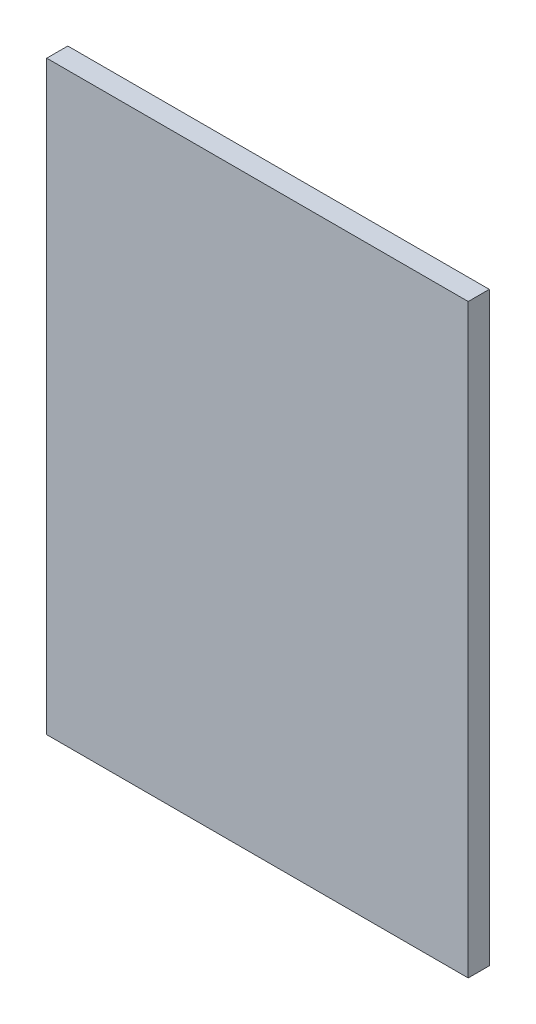
ISO-10303-21;
HEADER;
FILE_DESCRIPTION(('STEP AP214'),'2;1');
FILE_NAME('part.step','',(''),(''),'','','');
FILE_SCHEMA(('AUTOMOTIVE_DESIGN { 1 0 10303 214 1 1 1 1 }'));
ENDSEC;
DATA;
#1=APPLICATION_CONTEXT('core data for automotive mechanical design processes');
#2=APPLICATION_PROTOCOL_DEFINITION('international standard','automotive_design',2000,#1);
#3=PRODUCT_CONTEXT('',#1,'mechanical');
#4=PRODUCT('Part','Part','',(#3));
#5=PRODUCT_RELATED_PRODUCT_CATEGORY('part','',(#4));
#6=PRODUCT_DEFINITION_FORMATION('','',#4);
#7=PRODUCT_DEFINITION_CONTEXT('part definition',#1,'design');
#8=PRODUCT_DEFINITION('design','',#6,#7);
#9=PRODUCT_DEFINITION_SHAPE('','',#8);
#10=(LENGTH_UNIT() NAMED_UNIT(*) SI_UNIT(.MILLI.,.METRE.));
#11=(NAMED_UNIT(*) PLANE_ANGLE_UNIT() SI_UNIT($,.RADIAN.));
#12=(NAMED_UNIT(*) SI_UNIT($,.STERADIAN.) SOLID_ANGLE_UNIT());
#13=UNCERTAINTY_MEASURE_WITH_UNIT(LENGTH_MEASURE(1.E-05),#10,'distance_accuracy_value','');
#14=(GEOMETRIC_REPRESENTATION_CONTEXT(3) GLOBAL_UNCERTAINTY_ASSIGNED_CONTEXT((#13)) GLOBAL_UNIT_ASSIGNED_CONTEXT((#10,
#11,#12)) REPRESENTATION_CONTEXT('',''));
#15=CARTESIAN_POINT('',(0.,0.,0.));
#16=DIRECTION('',(0.,0.,1.));
#17=DIRECTION('',(1.,0.,0.));
#18=AXIS2_PLACEMENT_3D('',#15,#16,#17);
#19=CARTESIAN_POINT('',(0.,0.,0.));
#20=DIRECTION('',(0.,0.,1.));
#21=DIRECTION('',(1.,0.,0.));
#22=AXIS2_PLACEMENT_3D('',#19,#20,#21);
#23=PLANE('',#22);
#24=DIRECTION('',(1.,0.,0.));
#25=VECTOR('',#24,1.);
#26=CARTESIAN_POINT('',(-6.50000000000005,24.5,0.));
#27=LINE('',#26,#25);
#28=CARTESIAN_POINT('',(-9.00000000000004,24.5,0.));
#29=VERTEX_POINT('',#28);
#30=CARTESIAN_POINT('',(-6.50000000000005,24.5,0.));
#31=VERTEX_POINT('',#30);
#32=EDGE_CURVE('E273',#29,#31,#27,.T.);
#33=ORIENTED_EDGE('',*,*,#32,.F.);
#34=DIRECTION('',(0.,1.,0.));
#35=VECTOR('',#34,1.);
#36=CARTESIAN_POINT('',(-9.00000000000004,24.5,0.));
#37=LINE('',#36,#35);
#38=CARTESIAN_POINT('',(-9.00000000000004,-24.5,0.));
#39=VERTEX_POINT('',#38);
#40=EDGE_CURVE('E245',#39,#29,#37,.T.);
#41=ORIENTED_EDGE('',*,*,#40,.F.);
#42=DIRECTION('',(-1.,0.,0.));
#43=VECTOR('',#42,1.);
#44=CARTESIAN_POINT('',(-9.00000000000004,-24.5,0.));
#45=LINE('',#44,#43);
#46=CARTESIAN_POINT('',(-6.50000000000005,-24.5,0.));
#47=VERTEX_POINT('',#46);
#48=EDGE_CURVE('E267',#47,#39,#45,.T.);
#49=ORIENTED_EDGE('',*,*,#48,.F.);
#50=DIRECTION('',(0.,-1.,0.));
#51=VECTOR('',#50,1.);
#52=CARTESIAN_POINT('',(-6.50000000000005,-24.5,0.));
#53=LINE('',#52,#51);
#54=EDGE_CURVE('E276',#31,#47,#53,.T.);
#55=ORIENTED_EDGE('',*,*,#54,.F.);
#56=EDGE_LOOP('',(#33,#41,#49,#55));
#57=FACE_BOUND('',#56,.T.);
#58=DIRECTION('',(0.,-1.,0.));
#59=VECTOR('',#58,1.);
#60=CARTESIAN_POINT('',(-62.5,87.5,0.));
#61=LINE('',#60,#59);
#62=CARTESIAN_POINT('',(-62.5,69.5,0.));
#63=VERTEX_POINT('',#62);
#64=CARTESIAN_POINT('',(-62.5,-69.5,0.));
#65=VERTEX_POINT('',#64);
#66=EDGE_CURVE('E169',#63,#65,#61,.T.);
#67=ORIENTED_EDGE('',*,*,#66,.F.);
#68=DIRECTION('',(-1.,0.,0.));
#69=VECTOR('',#68,1.);
#70=CARTESIAN_POINT('',(37.5,69.5,0.));
#71=LINE('',#70,#69);
#72=CARTESIAN_POINT('',(37.5,69.5,0.));
#73=VERTEX_POINT('',#72);
#74=EDGE_CURVE('E160',#73,#63,#71,.T.);
#75=ORIENTED_EDGE('',*,*,#74,.F.);
#76=DIRECTION('',(0.,1.,0.));
#77=VECTOR('',#76,1.);
#78=CARTESIAN_POINT('',(37.5,-69.5,0.));
#79=LINE('',#78,#77);
#80=CARTESIAN_POINT('',(37.5,-69.5,0.));
#81=VERTEX_POINT('',#80);
#82=EDGE_CURVE('E378',#81,#73,#79,.T.);
#83=ORIENTED_EDGE('',*,*,#82,.F.);
#84=DIRECTION('',(1.,0.,0.));
#85=VECTOR('',#84,1.);
#86=CARTESIAN_POINT('',(-62.5,-69.5,0.));
#87=LINE('',#86,#85);
#88=EDGE_CURVE('E384',#65,#81,#87,.T.);
#89=ORIENTED_EDGE('',*,*,#88,.F.);
#90=EDGE_LOOP('',(#67,#75,#83,#89));
#91=FACE_BOUND('',#90,.T.);
#92=DIRECTION('',(1.,0.,0.));
#93=VECTOR('',#92,1.);
#94=CARTESIAN_POINT('',(-44.,24.5,0.));
#95=LINE('',#94,#93);
#96=CARTESIAN_POINT('',(-46.5,24.5,0.));
#97=VERTEX_POINT('',#96);
#98=CARTESIAN_POINT('',(-44.,24.5,0.));
#99=VERTEX_POINT('',#98);
#100=EDGE_CURVE('E443',#97,#99,#95,.T.);
#101=ORIENTED_EDGE('',*,*,#100,.F.);
#102=DIRECTION('',(0.,1.,0.));
#103=VECTOR('',#102,1.);
#104=CARTESIAN_POINT('',(-46.5,24.5,0.));
#105=LINE('',#104,#103);
#106=CARTESIAN_POINT('',(-46.5,-24.5,0.));
#107=VERTEX_POINT('',#106);
#108=EDGE_CURVE('E449',#107,#97,#105,.T.);
#109=ORIENTED_EDGE('',*,*,#108,.F.);
#110=DIRECTION('',(-1.,0.,0.));
#111=VECTOR('',#110,1.);
#112=CARTESIAN_POINT('',(-46.5,-24.5,0.));
#113=LINE('',#112,#111);
#114=CARTESIAN_POINT('',(-44.,-24.5,0.));
#115=VERTEX_POINT('',#114);
#116=EDGE_CURVE('E461',#115,#107,#113,.T.);
#117=ORIENTED_EDGE('',*,*,#116,.F.);
#118=DIRECTION('',(0.,-1.,0.));
#119=VECTOR('',#118,1.);
#120=CARTESIAN_POINT('',(-44.,-24.5,0.));
#121=LINE('',#120,#119);
#122=EDGE_CURVE('E457',#99,#115,#121,.T.);
#123=ORIENTED_EDGE('',*,*,#122,.F.);
#124=EDGE_LOOP('',(#101,#109,#117,#123));
#125=FACE_BOUND('',#124,.T.);
#126=ADVANCED_FACE('F38',(#57,#91,#125),#23,.F.);
#127=CARTESIAN_POINT('',(-62.5,87.5,5.));
#128=DIRECTION('',(1.,0.,0.));
#129=DIRECTION('',(0.,1.,0.));
#130=AXIS2_PLACEMENT_3D('',#127,#128,#129);
#131=PLANE('',#130);
#132=DIRECTION('',(0.,-1.,0.));
#133=VECTOR('',#132,1.);
#134=CARTESIAN_POINT('',(-62.5,87.5,5.));
#135=LINE('',#134,#133);
#136=CARTESIAN_POINT('',(-62.5,69.5,5.));
#137=VERTEX_POINT('',#136);
#138=CARTESIAN_POINT('',(-62.5,-69.5,5.));
#139=VERTEX_POINT('',#138);
#140=EDGE_CURVE('E167',#137,#139,#135,.T.);
#141=ORIENTED_EDGE('',*,*,#140,.F.);
#142=DIRECTION('',(0.,0.,-1.));
#143=VECTOR('',#142,1.);
#144=CARTESIAN_POINT('',(-62.5,69.5,5.));
#145=LINE('',#144,#143);
#146=EDGE_CURVE('E373',#137,#63,#145,.T.);
#147=ORIENTED_EDGE('',*,*,#146,.T.);
#148=ORIENTED_EDGE('',*,*,#66,.T.);
#149=DIRECTION('',(0.,0.,-1.));
#150=VECTOR('',#149,1.);
#151=CARTESIAN_POINT('',(-62.5,-69.5,5.));
#152=LINE('',#151,#150);
#153=EDGE_CURVE('E154',#139,#65,#152,.T.);
#154=ORIENTED_EDGE('',*,*,#153,.F.);
#155=EDGE_LOOP('',(#141,#147,#148,#154));
#156=FACE_BOUND('',#155,.T.);
#157=ADVANCED_FACE('F165',(#156),#131,.F.);
#158=CARTESIAN_POINT('',(0.,0.,5.));
#159=DIRECTION('',(0.,0.,1.));
#160=DIRECTION('',(1.,0.,0.));
#161=AXIS2_PLACEMENT_3D('',#158,#159,#160);
#162=PLANE('',#161);
#163=DIRECTION('',(-1.,0.,0.));
#164=VECTOR('',#163,1.);
#165=CARTESIAN_POINT('',(37.5,69.5,5.));
#166=LINE('',#165,#164);
#167=CARTESIAN_POINT('',(37.5,69.5,5.));
#168=VERTEX_POINT('',#167);
#169=EDGE_CURVE('E171',#168,#137,#166,.T.);
#170=ORIENTED_EDGE('',*,*,#169,.T.);
#171=ORIENTED_EDGE('',*,*,#140,.T.);
#172=DIRECTION('',(1.,0.,0.));
#173=VECTOR('',#172,1.);
#174=CARTESIAN_POINT('',(-62.5,-69.5,5.));
#175=LINE('',#174,#173);
#176=CARTESIAN_POINT('',(37.5,-69.5,5.));
#177=VERTEX_POINT('',#176);
#178=EDGE_CURVE('E150',#139,#177,#175,.T.);
#179=ORIENTED_EDGE('',*,*,#178,.T.);
#180=DIRECTION('',(0.,1.,0.));
#181=VECTOR('',#180,1.);
#182=CARTESIAN_POINT('',(37.5,-69.5,5.));
#183=LINE('',#182,#181);
#184=EDGE_CURVE('E54',#177,#168,#183,.T.);
#185=ORIENTED_EDGE('',*,*,#184,.T.);
#186=EDGE_LOOP('',(#170,#171,#179,#185));
#187=FACE_BOUND('',#186,.T.);
#188=ADVANCED_FACE('F174',(#187),#162,.T.);
#189=CARTESIAN_POINT('',(-6.50000000000005,24.5,-5.4));
#190=DIRECTION('',(0.,-1.,0.));
#191=DIRECTION('',(0.,0.,-1.));
#192=AXIS2_PLACEMENT_3D('',#189,#190,#191);
#193=PLANE('',#192);
#194=DIRECTION('',(0.,0.,1.));
#195=VECTOR('',#194,1.);
#196=CARTESIAN_POINT('',(-6.50000000000005,24.5,-5.4));
#197=LINE('',#196,#195);
#198=CARTESIAN_POINT('',(-6.50000000000005,24.5,-3.4));
#199=VERTEX_POINT('',#198);
#200=EDGE_CURVE('E184',#199,#31,#197,.T.);
#201=ORIENTED_EDGE('',*,*,#200,.F.);
#202=DIRECTION('',(1.,0.,0.));
#203=VECTOR('',#202,1.);
#204=CARTESIAN_POINT('',(-6.50000000000005,24.5,-3.4));
#205=LINE('',#204,#203);
#206=CARTESIAN_POINT('',(-9.00000000000004,24.5,-3.4));
#207=VERTEX_POINT('',#206);
#208=EDGE_CURVE('E47',#199,#207,#205,.F.);
#209=ORIENTED_EDGE('',*,*,#208,.T.);
#210=DIRECTION('',(0.,0.,1.));
#211=VECTOR('',#210,1.);
#212=CARTESIAN_POINT('',(-9.00000000000004,24.5,-5.4));
#213=LINE('',#212,#211);
#214=EDGE_CURVE('E235',#207,#29,#213,.T.);
#215=ORIENTED_EDGE('',*,*,#214,.T.);
#216=ORIENTED_EDGE('',*,*,#32,.T.);
#217=EDGE_LOOP('',(#201,#209,#215,#216));
#218=FACE_BOUND('',#217,.T.);
#219=ADVANCED_FACE('F233',(#218),#193,.F.);
#220=CARTESIAN_POINT('',(-6.50000000000005,-24.5,-5.4));
#221=DIRECTION('',(-1.,0.,0.));
#222=DIRECTION('',(0.,0.,1.));
#223=AXIS2_PLACEMENT_3D('',#220,#221,#222);
#224=PLANE('',#223);
#225=CARTESIAN_POINT('',(-6.50000000000005,-21.9,-2.7));
#226=DIRECTION('',(-1.,0.,0.));
#227=DIRECTION('',(0.,0.,1.));
#228=AXIS2_PLACEMENT_3D('',#225,#226,#227);
#229=CIRCLE('',#228,1.35);
#230=CARTESIAN_POINT('',(-6.50000000000003,-23.25,-2.7));
#231=VERTEX_POINT('',#230);
#232=EDGE_CURVE('E439',#231,#231,#229,.T.);
#233=ORIENTED_EDGE('',*,*,#232,.T.);
#234=EDGE_LOOP('',(#233));
#235=FACE_BOUND('',#234,.T.);
#236=CARTESIAN_POINT('',(-6.50000000000005,21.9,-2.7));
#237=DIRECTION('',(-1.,0.,0.));
#238=DIRECTION('',(0.,0.,1.));
#239=AXIS2_PLACEMENT_3D('',#236,#237,#238);
#240=CIRCLE('',#239,1.35);
#241=CARTESIAN_POINT('',(-6.50000000000003,20.55,-2.7));
#242=VERTEX_POINT('',#241);
#243=EDGE_CURVE('E427',#242,#242,#240,.T.);
#244=ORIENTED_EDGE('',*,*,#243,.T.);
#245=EDGE_LOOP('',(#244));
#246=FACE_BOUND('',#245,.T.);
#247=CARTESIAN_POINT('',(-6.50000000000005,0.,-2.7));
#248=DIRECTION('',(-1.,0.,0.));
#249=DIRECTION('',(0.,0.,1.));
#250=AXIS2_PLACEMENT_3D('',#247,#248,#249);
#251=CIRCLE('',#250,1.35);
#252=CARTESIAN_POINT('',(-6.50000000000003,-1.35,-2.7));
#253=VERTEX_POINT('',#252);
#254=EDGE_CURVE('E415',#253,#253,#251,.T.);
#255=ORIENTED_EDGE('',*,*,#254,.T.);
#256=EDGE_LOOP('',(#255));
#257=FACE_BOUND('',#256,.T.);
#258=DIRECTION('',(0.,0.,1.));
#259=VECTOR('',#258,1.);
#260=CARTESIAN_POINT('',(-6.50000000000005,-24.5,-5.4));
#261=LINE('',#260,#259);
#262=CARTESIAN_POINT('',(-6.50000000000005,-24.5,-3.4));
#263=VERTEX_POINT('',#262);
#264=EDGE_CURVE('E284',#263,#47,#261,.T.);
#265=ORIENTED_EDGE('',*,*,#264,.F.);
#266=CARTESIAN_POINT('',(-6.50000000000005,-22.5,-3.4));
#267=DIRECTION('',(-1.,0.,0.));
#268=DIRECTION('',(0.,0.,1.));
#269=AXIS2_PLACEMENT_3D('',#266,#267,#268);
#270=CIRCLE('',#269,2.);
#271=CARTESIAN_POINT('',(-6.50000000000005,-22.5,-5.4));
#272=VERTEX_POINT('',#271);
#273=EDGE_CURVE('E204',#263,#272,#270,.F.);
#274=ORIENTED_EDGE('',*,*,#273,.T.);
#275=DIRECTION('',(0.,-1.,0.));
#276=VECTOR('',#275,1.);
#277=CARTESIAN_POINT('',(-6.50000000000005,-24.5,-5.4));
#278=LINE('',#277,#276);
#279=CARTESIAN_POINT('',(-6.50000000000005,22.5,-5.4));
#280=VERTEX_POINT('',#279);
#281=EDGE_CURVE('E256',#280,#272,#278,.T.);
#282=ORIENTED_EDGE('',*,*,#281,.F.);
#283=CARTESIAN_POINT('',(-6.50000000000005,22.5,-3.4));
#284=DIRECTION('',(-1.,0.,0.));
#285=DIRECTION('',(0.,0.,1.));
#286=AXIS2_PLACEMENT_3D('',#283,#284,#285);
#287=CIRCLE('',#286,2.);
#288=EDGE_CURVE('E201',#280,#199,#287,.F.);
#289=ORIENTED_EDGE('',*,*,#288,.T.);
#290=ORIENTED_EDGE('',*,*,#200,.T.);
#291=ORIENTED_EDGE('',*,*,#54,.T.);
#292=EDGE_LOOP('',(#265,#274,#282,#289,#290,#291));
#293=FACE_BOUND('',#292,.T.);
#294=ADVANCED_FACE('F260',(#235,#246,#257,#293),#224,.F.);
#295=CARTESIAN_POINT('',(-9.00000000000004,-24.5,-5.4));
#296=DIRECTION('',(0.,1.,0.));
#297=DIRECTION('',(0.,0.,1.));
#298=AXIS2_PLACEMENT_3D('',#295,#296,#297);
#299=PLANE('',#298);
#300=DIRECTION('',(0.,0.,1.));
#301=VECTOR('',#300,1.);
#302=CARTESIAN_POINT('',(-9.00000000000004,-24.5,-5.4));
#303=LINE('',#302,#301);
#304=CARTESIAN_POINT('',(-9.00000000000004,-24.5,-3.4));
#305=VERTEX_POINT('',#304);
#306=EDGE_CURVE('E247',#305,#39,#303,.T.);
#307=ORIENTED_EDGE('',*,*,#306,.F.);
#308=DIRECTION('',(-1.,0.,0.));
#309=VECTOR('',#308,1.);
#310=CARTESIAN_POINT('',(-9.00000000000004,-24.5,-3.4));
#311=LINE('',#310,#309);
#312=EDGE_CURVE('E198',#305,#263,#311,.F.);
#313=ORIENTED_EDGE('',*,*,#312,.T.);
#314=ORIENTED_EDGE('',*,*,#264,.T.);
#315=ORIENTED_EDGE('',*,*,#48,.T.);
#316=EDGE_LOOP('',(#307,#313,#314,#315));
#317=FACE_BOUND('',#316,.T.);
#318=ADVANCED_FACE('F293',(#317),#299,.F.);
#319=CARTESIAN_POINT('',(-9.00000000000004,24.5,-5.4));
#320=DIRECTION('',(1.,0.,0.));
#321=DIRECTION('',(0.,0.,-1.));
#322=AXIS2_PLACEMENT_3D('',#319,#320,#321);
#323=PLANE('',#322);
#324=CARTESIAN_POINT('',(-9.00000000000004,-21.9,-2.7));
#325=DIRECTION('',(1.,0.,0.));
#326=DIRECTION('',(0.,0.,-1.));
#327=AXIS2_PLACEMENT_3D('',#324,#325,#326);
#328=CIRCLE('',#327,1.35);
#329=CARTESIAN_POINT('',(-9.00000000000004,-23.25,-2.7));
#330=VERTEX_POINT('',#329);
#331=EDGE_CURVE('E435',#330,#330,#328,.T.);
#332=ORIENTED_EDGE('',*,*,#331,.T.);
#333=EDGE_LOOP('',(#332));
#334=FACE_BOUND('',#333,.T.);
#335=CARTESIAN_POINT('',(-9.00000000000004,21.9,-2.7));
#336=DIRECTION('',(1.,0.,0.));
#337=DIRECTION('',(0.,0.,-1.));
#338=AXIS2_PLACEMENT_3D('',#335,#336,#337);
#339=CIRCLE('',#338,1.35);
#340=CARTESIAN_POINT('',(-9.00000000000004,20.55,-2.7));
#341=VERTEX_POINT('',#340);
#342=EDGE_CURVE('E423',#341,#341,#339,.T.);
#343=ORIENTED_EDGE('',*,*,#342,.T.);
#344=EDGE_LOOP('',(#343));
#345=FACE_BOUND('',#344,.T.);
#346=CARTESIAN_POINT('',(-9.00000000000004,0.,-2.7));
#347=DIRECTION('',(1.,0.,0.));
#348=DIRECTION('',(0.,0.,-1.));
#349=AXIS2_PLACEMENT_3D('',#346,#347,#348);
#350=CIRCLE('',#349,1.35);
#351=CARTESIAN_POINT('',(-9.00000000000004,-1.35,-2.7));
#352=VERTEX_POINT('',#351);
#353=EDGE_CURVE('E411',#352,#352,#350,.T.);
#354=ORIENTED_EDGE('',*,*,#353,.T.);
#355=EDGE_LOOP('',(#354));
#356=FACE_BOUND('',#355,.T.);
#357=DIRECTION('',(0.,1.,0.));
#358=VECTOR('',#357,1.);
#359=CARTESIAN_POINT('',(-9.00000000000004,24.5,-5.4));
#360=LINE('',#359,#358);
#361=CARTESIAN_POINT('',(-9.00000000000004,-22.5,-5.4));
#362=VERTEX_POINT('',#361);
#363=CARTESIAN_POINT('',(-9.00000000000004,22.5,-5.4));
#364=VERTEX_POINT('',#363);
#365=EDGE_CURVE('E248',#362,#364,#360,.T.);
#366=ORIENTED_EDGE('',*,*,#365,.F.);
#367=CARTESIAN_POINT('',(-9.00000000000004,-22.5,-3.4));
#368=DIRECTION('',(1.,0.,0.));
#369=DIRECTION('',(0.,0.,-1.));
#370=AXIS2_PLACEMENT_3D('',#367,#368,#369);
#371=CIRCLE('',#370,2.);
#372=EDGE_CURVE('E195',#362,#305,#371,.F.);
#373=ORIENTED_EDGE('',*,*,#372,.T.);
#374=ORIENTED_EDGE('',*,*,#306,.T.);
#375=ORIENTED_EDGE('',*,*,#40,.T.);
#376=ORIENTED_EDGE('',*,*,#214,.F.);
#377=CARTESIAN_POINT('',(-9.00000000000004,22.5,-3.4));
#378=DIRECTION('',(1.,0.,0.));
#379=DIRECTION('',(0.,0.,-1.));
#380=AXIS2_PLACEMENT_3D('',#377,#378,#379);
#381=CIRCLE('',#380,2.);
#382=EDGE_CURVE('E192',#207,#364,#381,.F.);
#383=ORIENTED_EDGE('',*,*,#382,.T.);
#384=EDGE_LOOP('',(#366,#373,#374,#375,#376,#383));
#385=FACE_BOUND('',#384,.T.);
#386=ADVANCED_FACE('F242',(#334,#345,#356,#385),#323,.F.);
#387=CARTESIAN_POINT('',(0.,0.,-5.4));
#388=DIRECTION('',(0.,0.,1.));
#389=DIRECTION('',(1.,0.,0.));
#390=AXIS2_PLACEMENT_3D('',#387,#388,#389);
#391=PLANE('',#390);
#392=ORIENTED_EDGE('',*,*,#281,.T.);
#393=DIRECTION('',(-1.,0.,0.));
#394=VECTOR('',#393,1.);
#395=CARTESIAN_POINT('',(0.,-22.5,-5.4));
#396=LINE('',#395,#394);
#397=EDGE_CURVE('E182',#272,#362,#396,.T.);
#398=ORIENTED_EDGE('',*,*,#397,.T.);
#399=ORIENTED_EDGE('',*,*,#365,.T.);
#400=DIRECTION('',(1.,0.,0.));
#401=VECTOR('',#400,1.);
#402=CARTESIAN_POINT('',(0.,22.5,-5.4));
#403=LINE('',#402,#401);
#404=EDGE_CURVE('E177',#364,#280,#403,.T.);
#405=ORIENTED_EDGE('',*,*,#404,.T.);
#406=EDGE_LOOP('',(#392,#398,#399,#405));
#407=FACE_BOUND('',#406,.T.);
#408=ADVANCED_FACE('F255',(#407),#391,.F.);
#409=CARTESIAN_POINT('',(-44.,24.5,-5.4));
#410=DIRECTION('',(0.,-1.,0.));
#411=DIRECTION('',(0.,0.,-1.));
#412=AXIS2_PLACEMENT_3D('',#409,#410,#411);
#413=PLANE('',#412);
#414=DIRECTION('',(0.,0.,1.));
#415=VECTOR('',#414,1.);
#416=CARTESIAN_POINT('',(-44.,24.5,-5.4));
#417=LINE('',#416,#415);
#418=CARTESIAN_POINT('',(-44.,24.5,-3.4));
#419=VERTEX_POINT('',#418);
#420=EDGE_CURVE('E270',#419,#99,#417,.T.);
#421=ORIENTED_EDGE('',*,*,#420,.F.);
#422=DIRECTION('',(1.,0.,0.));
#423=VECTOR('',#422,1.);
#424=CARTESIAN_POINT('',(-44.,24.5,-3.4));
#425=LINE('',#424,#423);
#426=CARTESIAN_POINT('',(-46.5,24.5,-3.4));
#427=VERTEX_POINT('',#426);
#428=EDGE_CURVE('E11',#419,#427,#425,.F.);
#429=ORIENTED_EDGE('',*,*,#428,.T.);
#430=DIRECTION('',(0.,0.,1.));
#431=VECTOR('',#430,1.);
#432=CARTESIAN_POINT('',(-46.5,24.5,-5.4));
#433=LINE('',#432,#431);
#434=EDGE_CURVE('E453',#427,#97,#433,.T.);
#435=ORIENTED_EDGE('',*,*,#434,.T.);
#436=ORIENTED_EDGE('',*,*,#100,.T.);
#437=EDGE_LOOP('',(#421,#429,#435,#436));
#438=FACE_BOUND('',#437,.T.);
#439=ADVANCED_FACE('F332',(#438),#413,.F.);
#440=CARTESIAN_POINT('',(-44.,-24.5,-5.4));
#441=DIRECTION('',(-1.,0.,0.));
#442=DIRECTION('',(0.,0.,1.));
#443=AXIS2_PLACEMENT_3D('',#440,#441,#442);
#444=PLANE('',#443);
#445=CARTESIAN_POINT('',(-44.,-21.9,-2.7));
#446=DIRECTION('',(-1.,0.,0.));
#447=DIRECTION('',(0.,0.,1.));
#448=AXIS2_PLACEMENT_3D('',#445,#446,#447);
#449=CIRCLE('',#448,1.35);
#450=CARTESIAN_POINT('',(-44.,-21.9,-1.35));
#451=VERTEX_POINT('',#450);
#452=EDGE_CURVE('E431',#451,#451,#449,.T.);
#453=ORIENTED_EDGE('',*,*,#452,.T.);
#454=EDGE_LOOP('',(#453));
#455=FACE_BOUND('',#454,.T.);
#456=CARTESIAN_POINT('',(-44.,21.9,-2.7));
#457=DIRECTION('',(-1.,0.,0.));
#458=DIRECTION('',(0.,0.,1.));
#459=AXIS2_PLACEMENT_3D('',#456,#457,#458);
#460=CIRCLE('',#459,1.35);
#461=CARTESIAN_POINT('',(-44.,21.9,-1.35));
#462=VERTEX_POINT('',#461);
#463=EDGE_CURVE('E419',#462,#462,#460,.T.);
#464=ORIENTED_EDGE('',*,*,#463,.T.);
#465=EDGE_LOOP('',(#464));
#466=FACE_BOUND('',#465,.T.);
#467=CARTESIAN_POINT('',(-44.,0.,-2.7));
#468=DIRECTION('',(-1.,0.,0.));
#469=DIRECTION('',(0.,0.,1.));
#470=AXIS2_PLACEMENT_3D('',#467,#468,#469);
#471=CIRCLE('',#470,1.35);
#472=CARTESIAN_POINT('',(-44.,0.,-1.35));
#473=VERTEX_POINT('',#472);
#474=EDGE_CURVE('E400',#473,#473,#471,.T.);
#475=ORIENTED_EDGE('',*,*,#474,.T.);
#476=EDGE_LOOP('',(#475));
#477=FACE_BOUND('',#476,.T.);
#478=DIRECTION('',(0.,0.,1.));
#479=VECTOR('',#478,1.);
#480=CARTESIAN_POINT('',(-44.,-24.5,-5.4));
#481=LINE('',#480,#479);
#482=CARTESIAN_POINT('',(-44.,-24.5,-3.4));
#483=VERTEX_POINT('',#482);
#484=EDGE_CURVE('E472',#483,#115,#481,.T.);
#485=ORIENTED_EDGE('',*,*,#484,.F.);
#486=CARTESIAN_POINT('',(-44.,-22.5,-3.4));
#487=DIRECTION('',(-1.,0.,0.));
#488=DIRECTION('',(0.,0.,1.));
#489=AXIS2_PLACEMENT_3D('',#486,#487,#488);
#490=CIRCLE('',#489,2.);
#491=CARTESIAN_POINT('',(-44.,-22.5,-5.4));
#492=VERTEX_POINT('',#491);
#493=EDGE_CURVE('E226',#483,#492,#490,.F.);
#494=ORIENTED_EDGE('',*,*,#493,.T.);
#495=DIRECTION('',(0.,-1.,0.));
#496=VECTOR('',#495,1.);
#497=CARTESIAN_POINT('',(-44.,-24.5,-5.4));
#498=LINE('',#497,#496);
#499=CARTESIAN_POINT('',(-44.,22.5,-5.4));
#500=VERTEX_POINT('',#499);
#501=EDGE_CURVE('E444',#500,#492,#498,.T.);
#502=ORIENTED_EDGE('',*,*,#501,.F.);
#503=CARTESIAN_POINT('',(-44.,22.5,-3.4));
#504=DIRECTION('',(-1.,0.,0.));
#505=DIRECTION('',(0.,0.,1.));
#506=AXIS2_PLACEMENT_3D('',#503,#504,#505);
#507=CIRCLE('',#506,2.);
#508=EDGE_CURVE('E62',#500,#419,#507,.F.);
#509=ORIENTED_EDGE('',*,*,#508,.T.);
#510=ORIENTED_EDGE('',*,*,#420,.T.);
#511=ORIENTED_EDGE('',*,*,#122,.T.);
#512=EDGE_LOOP('',(#485,#494,#502,#509,#510,#511));
#513=FACE_BOUND('',#512,.T.);
#514=ADVANCED_FACE('F335',(#455,#466,#477,#513),#444,.F.);
#515=CARTESIAN_POINT('',(-46.5,-24.5,-5.4));
#516=DIRECTION('',(0.,1.,0.));
#517=DIRECTION('',(0.,0.,1.));
#518=AXIS2_PLACEMENT_3D('',#515,#516,#517);
#519=PLANE('',#518);
#520=DIRECTION('',(0.,0.,1.));
#521=VECTOR('',#520,1.);
#522=CARTESIAN_POINT('',(-46.5,-24.5,-5.4));
#523=LINE('',#522,#521);
#524=CARTESIAN_POINT('',(-46.5,-24.5,-3.4));
#525=VERTEX_POINT('',#524);
#526=EDGE_CURVE('E470',#525,#107,#523,.T.);
#527=ORIENTED_EDGE('',*,*,#526,.F.);
#528=DIRECTION('',(-1.,0.,0.));
#529=VECTOR('',#528,1.);
#530=CARTESIAN_POINT('',(-46.5,-24.5,-3.4));
#531=LINE('',#530,#529);
#532=EDGE_CURVE('E221',#525,#483,#531,.F.);
#533=ORIENTED_EDGE('',*,*,#532,.T.);
#534=ORIENTED_EDGE('',*,*,#484,.T.);
#535=ORIENTED_EDGE('',*,*,#116,.T.);
#536=EDGE_LOOP('',(#527,#533,#534,#535));
#537=FACE_BOUND('',#536,.T.);
#538=ADVANCED_FACE('F339',(#537),#519,.F.);
#539=CARTESIAN_POINT('',(-46.5,24.5,-5.4));
#540=DIRECTION('',(1.,0.,0.));
#541=DIRECTION('',(0.,1.,0.));
#542=AXIS2_PLACEMENT_3D('',#539,#540,#541);
#543=PLANE('',#542);
#544=CARTESIAN_POINT('',(-46.5,-21.9,-2.7));
#545=DIRECTION('',(-1.,0.,0.));
#546=DIRECTION('',(0.,-1.,0.));
#547=AXIS2_PLACEMENT_3D('',#544,#545,#546);
#548=CIRCLE('',#547,1.35);
#549=CARTESIAN_POINT('',(-46.5,-23.25,-2.7));
#550=VERTEX_POINT('',#549);
#551=EDGE_CURVE('E396',#550,#550,#548,.T.);
#552=ORIENTED_EDGE('',*,*,#551,.F.);
#553=EDGE_LOOP('',(#552));
#554=FACE_BOUND('',#553,.T.);
#555=CARTESIAN_POINT('',(-46.5,21.9,-2.7));
#556=DIRECTION('',(-1.,0.,0.));
#557=DIRECTION('',(0.,-1.,0.));
#558=AXIS2_PLACEMENT_3D('',#555,#556,#557);
#559=CIRCLE('',#558,1.35);
#560=CARTESIAN_POINT('',(-46.5,20.55,-2.7));
#561=VERTEX_POINT('',#560);
#562=EDGE_CURVE('E401',#561,#561,#559,.T.);
#563=ORIENTED_EDGE('',*,*,#562,.F.);
#564=EDGE_LOOP('',(#563));
#565=FACE_BOUND('',#564,.T.);
#566=CARTESIAN_POINT('',(-46.5,0.,-2.7));
#567=DIRECTION('',(-1.,0.,0.));
#568=DIRECTION('',(0.,-1.,0.));
#569=AXIS2_PLACEMENT_3D('',#566,#567,#568);
#570=CIRCLE('',#569,1.35);
#571=CARTESIAN_POINT('',(-46.5,-1.34999999999999,-2.7));
#572=VERTEX_POINT('',#571);
#573=EDGE_CURVE('E381',#572,#572,#570,.T.);
#574=ORIENTED_EDGE('',*,*,#573,.F.);
#575=EDGE_LOOP('',(#574));
#576=FACE_BOUND('',#575,.T.);
#577=DIRECTION('',(0.,1.,0.));
#578=VECTOR('',#577,1.);
#579=CARTESIAN_POINT('',(-46.5,24.5,-5.4));
#580=LINE('',#579,#578);
#581=CARTESIAN_POINT('',(-46.5,-22.5,-5.4));
#582=VERTEX_POINT('',#581);
#583=CARTESIAN_POINT('',(-46.5,22.5,-5.4));
#584=VERTEX_POINT('',#583);
#585=EDGE_CURVE('E448',#582,#584,#580,.T.);
#586=ORIENTED_EDGE('',*,*,#585,.F.);
#587=CARTESIAN_POINT('',(-46.5,-22.5,-3.4));
#588=DIRECTION('',(1.,0.,0.));
#589=DIRECTION('',(0.,1.,0.));
#590=AXIS2_PLACEMENT_3D('',#587,#588,#589);
#591=CIRCLE('',#590,2.);
#592=EDGE_CURVE('E218',#582,#525,#591,.F.);
#593=ORIENTED_EDGE('',*,*,#592,.T.);
#594=ORIENTED_EDGE('',*,*,#526,.T.);
#595=ORIENTED_EDGE('',*,*,#108,.T.);
#596=ORIENTED_EDGE('',*,*,#434,.F.);
#597=CARTESIAN_POINT('',(-46.5,22.5,-3.4));
#598=DIRECTION('',(1.,0.,0.));
#599=DIRECTION('',(0.,1.,0.));
#600=AXIS2_PLACEMENT_3D('',#597,#598,#599);
#601=CIRCLE('',#600,2.);
#602=EDGE_CURVE('E215',#427,#584,#601,.F.);
#603=ORIENTED_EDGE('',*,*,#602,.T.);
#604=EDGE_LOOP('',(#586,#593,#594,#595,#596,#603));
#605=FACE_BOUND('',#604,.T.);
#606=ADVANCED_FACE('F307',(#554,#565,#576,#605),#543,.F.);
#607=CARTESIAN_POINT('',(0.,0.,-5.4));
#608=DIRECTION('',(0.,0.,1.));
#609=DIRECTION('',(1.,0.,0.));
#610=AXIS2_PLACEMENT_3D('',#607,#608,#609);
#611=PLANE('',#610);
#612=ORIENTED_EDGE('',*,*,#501,.T.);
#613=DIRECTION('',(-1.,0.,0.));
#614=VECTOR('',#613,1.);
#615=CARTESIAN_POINT('',(0.,-22.5,-5.4));
#616=LINE('',#615,#614);
#617=EDGE_CURVE('E211',#492,#582,#616,.T.);
#618=ORIENTED_EDGE('',*,*,#617,.T.);
#619=ORIENTED_EDGE('',*,*,#585,.T.);
#620=DIRECTION('',(1.,0.,0.));
#621=VECTOR('',#620,1.);
#622=CARTESIAN_POINT('',(0.,22.5,-5.4));
#623=LINE('',#622,#621);
#624=EDGE_CURVE('E207',#584,#500,#623,.T.);
#625=ORIENTED_EDGE('',*,*,#624,.T.);
#626=EDGE_LOOP('',(#612,#618,#619,#625));
#627=FACE_BOUND('',#626,.T.);
#628=ADVANCED_FACE('F299',(#627),#611,.F.);
#629=CARTESIAN_POINT('',(0.,-22.5,-3.4));
#630=DIRECTION('',(-1.,0.,0.));
#631=DIRECTION('',(0.,0.,1.));
#632=AXIS2_PLACEMENT_3D('',#629,#630,#631);
#633=CYLINDRICAL_SURFACE('',#632,2.);
#634=ORIENTED_EDGE('',*,*,#273,.F.);
#635=ORIENTED_EDGE('',*,*,#312,.F.);
#636=ORIENTED_EDGE('',*,*,#372,.F.);
#637=ORIENTED_EDGE('',*,*,#397,.F.);
#638=EDGE_LOOP('',(#634,#635,#636,#637));
#639=FACE_BOUND('',#638,.T.);
#640=ADVANCED_FACE('F296',(#639),#633,.T.);
#641=CARTESIAN_POINT('',(0.,-22.5,-3.4));
#642=DIRECTION('',(-1.,0.,0.));
#643=DIRECTION('',(0.,0.,1.));
#644=AXIS2_PLACEMENT_3D('',#641,#642,#643);
#645=CYLINDRICAL_SURFACE('',#644,2.);
#646=ORIENTED_EDGE('',*,*,#493,.F.);
#647=ORIENTED_EDGE('',*,*,#532,.F.);
#648=ORIENTED_EDGE('',*,*,#592,.F.);
#649=ORIENTED_EDGE('',*,*,#617,.F.);
#650=EDGE_LOOP('',(#646,#647,#648,#649));
#651=FACE_BOUND('',#650,.T.);
#652=ADVANCED_FACE('F298',(#651),#645,.T.);
#653=CARTESIAN_POINT('',(0.,22.5,-3.4));
#654=DIRECTION('',(1.,0.,0.));
#655=DIRECTION('',(0.,0.,-1.));
#656=AXIS2_PLACEMENT_3D('',#653,#654,#655);
#657=CYLINDRICAL_SURFACE('',#656,2.);
#658=ORIENTED_EDGE('',*,*,#382,.F.);
#659=ORIENTED_EDGE('',*,*,#208,.F.);
#660=ORIENTED_EDGE('',*,*,#288,.F.);
#661=ORIENTED_EDGE('',*,*,#404,.F.);
#662=EDGE_LOOP('',(#658,#659,#660,#661));
#663=FACE_BOUND('',#662,.T.);
#664=ADVANCED_FACE('F251',(#663),#657,.T.);
#665=CARTESIAN_POINT('',(0.,22.5,-3.4));
#666=DIRECTION('',(1.,0.,0.));
#667=DIRECTION('',(0.,0.,-1.));
#668=AXIS2_PLACEMENT_3D('',#665,#666,#667);
#669=CYLINDRICAL_SURFACE('',#668,2.);
#670=ORIENTED_EDGE('',*,*,#602,.F.);
#671=ORIENTED_EDGE('',*,*,#428,.F.);
#672=ORIENTED_EDGE('',*,*,#508,.F.);
#673=ORIENTED_EDGE('',*,*,#624,.F.);
#674=EDGE_LOOP('',(#670,#671,#672,#673));
#675=FACE_BOUND('',#674,.T.);
#676=ADVANCED_FACE('F40',(#675),#669,.T.);
#677=CARTESIAN_POINT('',(62.5,0.,-2.7));
#678=DIRECTION('',(-1.,0.,0.));
#679=DIRECTION('',(0.,-1.,0.));
#680=AXIS2_PLACEMENT_3D('',#677,#678,#679);
#681=CYLINDRICAL_SURFACE('',#680,1.35);
#682=ORIENTED_EDGE('',*,*,#573,.T.);
#683=EDGE_LOOP('',(#682));
#684=FACE_BOUND('',#683,.T.);
#685=ORIENTED_EDGE('',*,*,#474,.F.);
#686=EDGE_LOOP('',(#685));
#687=FACE_BOUND('',#686,.T.);
#688=ADVANCED_FACE('F353',(#684,#687),#681,.F.);
#689=CARTESIAN_POINT('',(62.5,21.9,-2.7));
#690=DIRECTION('',(-1.,0.,0.));
#691=DIRECTION('',(0.,-1.,0.));
#692=AXIS2_PLACEMENT_3D('',#689,#690,#691);
#693=CYLINDRICAL_SURFACE('',#692,1.35);
#694=ORIENTED_EDGE('',*,*,#562,.T.);
#695=EDGE_LOOP('',(#694));
#696=FACE_BOUND('',#695,.T.);
#697=ORIENTED_EDGE('',*,*,#463,.F.);
#698=EDGE_LOOP('',(#697));
#699=FACE_BOUND('',#698,.T.);
#700=ADVANCED_FACE('F358',(#696,#699),#693,.F.);
#701=CARTESIAN_POINT('',(62.5,-21.9,-2.7));
#702=DIRECTION('',(-1.,0.,0.));
#703=DIRECTION('',(0.,-1.,0.));
#704=AXIS2_PLACEMENT_3D('',#701,#702,#703);
#705=CYLINDRICAL_SURFACE('',#704,1.35);
#706=ORIENTED_EDGE('',*,*,#551,.T.);
#707=EDGE_LOOP('',(#706));
#708=FACE_BOUND('',#707,.T.);
#709=ORIENTED_EDGE('',*,*,#452,.F.);
#710=EDGE_LOOP('',(#709));
#711=FACE_BOUND('',#710,.T.);
#712=ADVANCED_FACE('F351',(#708,#711),#705,.F.);
#713=CARTESIAN_POINT('',(-9.00000000000004,-1.35,-2.7));
#714=CARTESIAN_POINT('',(-8.97395833333337,-1.35,-2.7));
#715=CARTESIAN_POINT('',(-8.9479166666667,-1.35,-2.7));
#716=CARTESIAN_POINT('',(-8.89583333333337,-1.35,-2.7));
#717=CARTESIAN_POINT('',(-8.86979166666671,-1.35,-2.7));
#718=CARTESIAN_POINT('',(-8.81770833333337,-1.35,-2.7));
#719=CARTESIAN_POINT('',(-8.79166666666671,-1.35,-2.7));
#720=CARTESIAN_POINT('',(-8.73958333333337,-1.35,-2.7));
#721=CARTESIAN_POINT('',(-8.71354166666671,-1.35,-2.7));
#722=CARTESIAN_POINT('',(-8.66145833333337,-1.35,-2.7));
#723=CARTESIAN_POINT('',(-8.6354166666667,-1.35,-2.7));
#724=CARTESIAN_POINT('',(-8.58333333333336,-1.35,-2.7));
#725=CARTESIAN_POINT('',(-8.5572916666667,-1.35,-2.7));
#726=CARTESIAN_POINT('',(-8.50520833333337,-1.35,-2.7));
#727=CARTESIAN_POINT('',(-8.4791666666667,-1.35,-2.7));
#728=CARTESIAN_POINT('',(-8.42708333333337,-1.35,-2.7));
#729=CARTESIAN_POINT('',(-8.4010416666667,-1.35,-2.7));
#730=CARTESIAN_POINT('',(-8.34895833333337,-1.35,-2.7));
#731=CARTESIAN_POINT('',(-8.3229166666667,-1.35,-2.7));
#732=CARTESIAN_POINT('',(-8.27083333333337,-1.35,-2.7));
#733=CARTESIAN_POINT('',(-8.2447916666667,-1.35,-2.7));
#734=CARTESIAN_POINT('',(-8.19270833333337,-1.35,-2.7));
#735=CARTESIAN_POINT('',(-8.16666666666671,-1.35,-2.7));
#736=CARTESIAN_POINT('',(-8.11458333333337,-1.35,-2.7));
#737=CARTESIAN_POINT('',(-8.0885416666667,-1.35,-2.7));
#738=CARTESIAN_POINT('',(-8.03645833333336,-1.35,-2.7));
#739=CARTESIAN_POINT('',(-8.01041666666669,-1.35,-2.7));
#740=CARTESIAN_POINT('',(-7.95833333333336,-1.35,-2.7));
#741=CARTESIAN_POINT('',(-7.9322916666667,-1.35,-2.7));
#742=CARTESIAN_POINT('',(-7.88020833333337,-1.35,-2.7));
#743=CARTESIAN_POINT('',(-7.8541666666667,-1.35,-2.7));
#744=CARTESIAN_POINT('',(-7.80208333333337,-1.35,-2.7));
#745=CARTESIAN_POINT('',(-7.7760416666667,-1.35,-2.7));
#746=CARTESIAN_POINT('',(-7.72395833333337,-1.35,-2.7));
#747=CARTESIAN_POINT('',(-7.6979166666667,-1.35,-2.7));
#748=CARTESIAN_POINT('',(-7.64583333333337,-1.35,-2.7));
#749=CARTESIAN_POINT('',(-7.6197916666667,-1.35,-2.7));
#750=CARTESIAN_POINT('',(-7.56770833333337,-1.35,-2.7));
#751=CARTESIAN_POINT('',(-7.54166666666671,-1.35,-2.7));
#752=CARTESIAN_POINT('',(-7.48958333333337,-1.35,-2.7));
#753=CARTESIAN_POINT('',(-7.46354166666671,-1.35,-2.7));
#754=CARTESIAN_POINT('',(-7.41145833333337,-1.35,-2.7));
#755=CARTESIAN_POINT('',(-7.3854166666667,-1.35,-2.7));
#756=CARTESIAN_POINT('',(-7.33333333333336,-1.35,-2.7));
#757=CARTESIAN_POINT('',(-7.3072916666667,-1.35,-2.7));
#758=CARTESIAN_POINT('',(-7.25520833333336,-1.35,-2.7));
#759=CARTESIAN_POINT('',(-7.2291666666667,-1.35,-2.7));
#760=CARTESIAN_POINT('',(-7.17708333333337,-1.35,-2.7));
#761=CARTESIAN_POINT('',(-7.1510416666667,-1.35,-2.7));
#762=CARTESIAN_POINT('',(-7.09895833333337,-1.35,-2.7));
#763=CARTESIAN_POINT('',(-7.0729166666667,-1.35,-2.7));
#764=CARTESIAN_POINT('',(-7.02083333333337,-1.35,-2.7));
#765=CARTESIAN_POINT('',(-6.9947916666667,-1.35,-2.7));
#766=CARTESIAN_POINT('',(-6.94270833333337,-1.35,-2.7));
#767=CARTESIAN_POINT('',(-6.91666666666671,-1.35,-2.7));
#768=CARTESIAN_POINT('',(-6.86458333333337,-1.35,-2.7));
#769=CARTESIAN_POINT('',(-6.8385416666667,-1.35,-2.7));
#770=CARTESIAN_POINT('',(-6.78645833333336,-1.35,-2.7));
#771=CARTESIAN_POINT('',(-6.76041666666669,-1.35,-2.7));
#772=CARTESIAN_POINT('',(-6.70833333333336,-1.35,-2.7));
#773=CARTESIAN_POINT('',(-6.6822916666667,-1.35,-2.7));
#774=CARTESIAN_POINT('',(-6.63020833333336,-1.35,-2.7));
#775=CARTESIAN_POINT('',(-6.6041666666667,-1.35,-2.7));
#776=CARTESIAN_POINT('',(-6.55208333333337,-1.35,-2.7));
#777=CARTESIAN_POINT('',(-6.5260416666667,-1.35,-2.7));
#778=CARTESIAN_POINT('',(-6.50000000000003,-1.35,-2.7));
#779=B_SPLINE_CURVE_WITH_KNOTS('',3,(#713,#714,#715,#716,#717,#718,#719,#720,#721,#722,#723,
#724,#725,#726,#727,#728,#729,#730,#731,#732,#733,#734,#735,#736,#737,#738,#739,#740,#741,#742,
#743,#744,#745,#746,#747,#748,#749,#750,#751,#752,#753,#754,#755,#756,#757,#758,#759,#760,#761,
#762,#763,#764,#765,#766,#767,#768,#769,#770,#771,#772,#773,#774,#775,#776,#777,#778),
.UNSPECIFIED.,.F.,.F.,(4,2,2,2,2,2,2,2,2,2,2,2,2,2,2,2,2,2,2,2,2,2,2,2,2,2,2,2,2,2,2,2,4),(0.,
0.0781249999999983,0.156249999999997,0.234374999999995,0.312499999999993,0.390625000000006,
0.468750000000004,0.546875000000002,0.625000000000001,0.703124999999999,0.781249999999997,
0.859374999999996,0.937500000000008,1.01562500000001,1.09375,1.171875,1.25,1.328125,1.40625,
1.484375,1.56249999999999,1.64062500000001,1.71875,1.796875,1.875,1.953125,2.03125,2.109375,
2.18750000000001,2.26562500000001,2.34375000000001,2.421875,2.5),.UNSPECIFIED.);
#780=EDGE_CURVE('BSEAM347',#352,#253,#779,.T.);
#781=ORIENTED_EDGE('',*,*,#353,.F.);
#782=ORIENTED_EDGE('',*,*,#254,.F.);
#783=ORIENTED_EDGE('',*,*,#780,.T.);
#784=ORIENTED_EDGE('',*,*,#780,.F.);
#785=EDGE_LOOP('',(#781,#783,#782,#784));
#786=FACE_BOUND('',#785,.T.);
#787=ADVANCED_FACE('F347',(#786),#681,.F.);
#788=CARTESIAN_POINT('',(-9.00000000000004,20.55,-2.7));
#789=CARTESIAN_POINT('',(-8.97395833333337,20.55,-2.7));
#790=CARTESIAN_POINT('',(-8.9479166666667,20.55,-2.7));
#791=CARTESIAN_POINT('',(-8.89583333333337,20.55,-2.7));
#792=CARTESIAN_POINT('',(-8.86979166666671,20.55,-2.7));
#793=CARTESIAN_POINT('',(-8.81770833333337,20.55,-2.7));
#794=CARTESIAN_POINT('',(-8.79166666666671,20.55,-2.7));
#795=CARTESIAN_POINT('',(-8.73958333333337,20.55,-2.7));
#796=CARTESIAN_POINT('',(-8.71354166666671,20.55,-2.7));
#797=CARTESIAN_POINT('',(-8.66145833333337,20.55,-2.7));
#798=CARTESIAN_POINT('',(-8.6354166666667,20.55,-2.7));
#799=CARTESIAN_POINT('',(-8.58333333333336,20.55,-2.7));
#800=CARTESIAN_POINT('',(-8.5572916666667,20.55,-2.7));
#801=CARTESIAN_POINT('',(-8.50520833333337,20.55,-2.7));
#802=CARTESIAN_POINT('',(-8.4791666666667,20.55,-2.7));
#803=CARTESIAN_POINT('',(-8.42708333333337,20.55,-2.7));
#804=CARTESIAN_POINT('',(-8.4010416666667,20.55,-2.7));
#805=CARTESIAN_POINT('',(-8.34895833333337,20.55,-2.7));
#806=CARTESIAN_POINT('',(-8.3229166666667,20.55,-2.7));
#807=CARTESIAN_POINT('',(-8.27083333333337,20.55,-2.7));
#808=CARTESIAN_POINT('',(-8.2447916666667,20.55,-2.7));
#809=CARTESIAN_POINT('',(-8.19270833333337,20.55,-2.7));
#810=CARTESIAN_POINT('',(-8.16666666666671,20.55,-2.7));
#811=CARTESIAN_POINT('',(-8.11458333333337,20.55,-2.7));
#812=CARTESIAN_POINT('',(-8.0885416666667,20.55,-2.7));
#813=CARTESIAN_POINT('',(-8.03645833333336,20.55,-2.7));
#814=CARTESIAN_POINT('',(-8.01041666666669,20.55,-2.7));
#815=CARTESIAN_POINT('',(-7.95833333333336,20.55,-2.7));
#816=CARTESIAN_POINT('',(-7.9322916666667,20.55,-2.7));
#817=CARTESIAN_POINT('',(-7.88020833333337,20.55,-2.7));
#818=CARTESIAN_POINT('',(-7.8541666666667,20.55,-2.7));
#819=CARTESIAN_POINT('',(-7.80208333333337,20.55,-2.7));
#820=CARTESIAN_POINT('',(-7.7760416666667,20.55,-2.7));
#821=CARTESIAN_POINT('',(-7.72395833333337,20.55,-2.7));
#822=CARTESIAN_POINT('',(-7.6979166666667,20.55,-2.7));
#823=CARTESIAN_POINT('',(-7.64583333333337,20.55,-2.7));
#824=CARTESIAN_POINT('',(-7.6197916666667,20.55,-2.7));
#825=CARTESIAN_POINT('',(-7.56770833333337,20.55,-2.7));
#826=CARTESIAN_POINT('',(-7.54166666666671,20.55,-2.7));
#827=CARTESIAN_POINT('',(-7.48958333333337,20.55,-2.7));
#828=CARTESIAN_POINT('',(-7.46354166666671,20.55,-2.7));
#829=CARTESIAN_POINT('',(-7.41145833333337,20.55,-2.7));
#830=CARTESIAN_POINT('',(-7.3854166666667,20.55,-2.7));
#831=CARTESIAN_POINT('',(-7.33333333333336,20.55,-2.7));
#832=CARTESIAN_POINT('',(-7.3072916666667,20.55,-2.7));
#833=CARTESIAN_POINT('',(-7.25520833333336,20.55,-2.7));
#834=CARTESIAN_POINT('',(-7.2291666666667,20.55,-2.7));
#835=CARTESIAN_POINT('',(-7.17708333333337,20.55,-2.7));
#836=CARTESIAN_POINT('',(-7.1510416666667,20.55,-2.7));
#837=CARTESIAN_POINT('',(-7.09895833333337,20.55,-2.7));
#838=CARTESIAN_POINT('',(-7.0729166666667,20.55,-2.7));
#839=CARTESIAN_POINT('',(-7.02083333333337,20.55,-2.7));
#840=CARTESIAN_POINT('',(-6.9947916666667,20.55,-2.7));
#841=CARTESIAN_POINT('',(-6.94270833333337,20.55,-2.7));
#842=CARTESIAN_POINT('',(-6.91666666666671,20.55,-2.7));
#843=CARTESIAN_POINT('',(-6.86458333333337,20.55,-2.7));
#844=CARTESIAN_POINT('',(-6.8385416666667,20.55,-2.7));
#845=CARTESIAN_POINT('',(-6.78645833333336,20.55,-2.7));
#846=CARTESIAN_POINT('',(-6.76041666666669,20.55,-2.7));
#847=CARTESIAN_POINT('',(-6.70833333333336,20.55,-2.7));
#848=CARTESIAN_POINT('',(-6.6822916666667,20.55,-2.7));
#849=CARTESIAN_POINT('',(-6.63020833333336,20.55,-2.7));
#850=CARTESIAN_POINT('',(-6.6041666666667,20.55,-2.7));
#851=CARTESIAN_POINT('',(-6.55208333333337,20.55,-2.7));
#852=CARTESIAN_POINT('',(-6.5260416666667,20.55,-2.7));
#853=CARTESIAN_POINT('',(-6.50000000000003,20.55,-2.7));
#854=B_SPLINE_CURVE_WITH_KNOTS('',3,(#788,#789,#790,#791,#792,#793,#794,#795,#796,#797,#798,
#799,#800,#801,#802,#803,#804,#805,#806,#807,#808,#809,#810,#811,#812,#813,#814,#815,#816,#817,
#818,#819,#820,#821,#822,#823,#824,#825,#826,#827,#828,#829,#830,#831,#832,#833,#834,#835,#836,
#837,#838,#839,#840,#841,#842,#843,#844,#845,#846,#847,#848,#849,#850,#851,#852,#853),
.UNSPECIFIED.,.F.,.F.,(4,2,2,2,2,2,2,2,2,2,2,2,2,2,2,2,2,2,2,2,2,2,2,2,2,2,2,2,2,2,2,2,4),(0.,
0.0781249999999983,0.156249999999997,0.234374999999995,0.312499999999993,0.390625000000006,
0.468750000000004,0.546875000000002,0.625000000000001,0.703124999999999,0.781249999999997,
0.859374999999996,0.937500000000008,1.01562500000001,1.09375,1.171875,1.25,1.328125,1.40625,
1.484375,1.56249999999999,1.64062500000001,1.71875,1.796875,1.875,1.953125,2.03125,2.109375,
2.18750000000001,2.26562500000001,2.34375000000001,2.421875,2.5),.UNSPECIFIED.);
#855=EDGE_CURVE('BSEAM350',#341,#242,#854,.T.);
#856=ORIENTED_EDGE('',*,*,#342,.F.);
#857=ORIENTED_EDGE('',*,*,#243,.F.);
#858=ORIENTED_EDGE('',*,*,#855,.T.);
#859=ORIENTED_EDGE('',*,*,#855,.F.);
#860=EDGE_LOOP('',(#856,#858,#857,#859));
#861=FACE_BOUND('',#860,.T.);
#862=ADVANCED_FACE('F350',(#861),#693,.F.);
#863=CARTESIAN_POINT('',(-9.00000000000004,-23.25,-2.7));
#864=CARTESIAN_POINT('',(-8.97395833333337,-23.25,-2.7));
#865=CARTESIAN_POINT('',(-8.9479166666667,-23.25,-2.7));
#866=CARTESIAN_POINT('',(-8.89583333333337,-23.25,-2.7));
#867=CARTESIAN_POINT('',(-8.86979166666671,-23.25,-2.7));
#868=CARTESIAN_POINT('',(-8.81770833333337,-23.25,-2.7));
#869=CARTESIAN_POINT('',(-8.79166666666671,-23.25,-2.7));
#870=CARTESIAN_POINT('',(-8.73958333333337,-23.25,-2.7));
#871=CARTESIAN_POINT('',(-8.71354166666671,-23.25,-2.7));
#872=CARTESIAN_POINT('',(-8.66145833333337,-23.25,-2.7));
#873=CARTESIAN_POINT('',(-8.6354166666667,-23.25,-2.7));
#874=CARTESIAN_POINT('',(-8.58333333333336,-23.25,-2.7));
#875=CARTESIAN_POINT('',(-8.5572916666667,-23.25,-2.7));
#876=CARTESIAN_POINT('',(-8.50520833333337,-23.25,-2.7));
#877=CARTESIAN_POINT('',(-8.4791666666667,-23.25,-2.7));
#878=CARTESIAN_POINT('',(-8.42708333333337,-23.25,-2.7));
#879=CARTESIAN_POINT('',(-8.4010416666667,-23.25,-2.7));
#880=CARTESIAN_POINT('',(-8.34895833333337,-23.25,-2.7));
#881=CARTESIAN_POINT('',(-8.3229166666667,-23.25,-2.7));
#882=CARTESIAN_POINT('',(-8.27083333333337,-23.25,-2.7));
#883=CARTESIAN_POINT('',(-8.2447916666667,-23.25,-2.7));
#884=CARTESIAN_POINT('',(-8.19270833333337,-23.25,-2.7));
#885=CARTESIAN_POINT('',(-8.16666666666671,-23.25,-2.7));
#886=CARTESIAN_POINT('',(-8.11458333333337,-23.25,-2.7));
#887=CARTESIAN_POINT('',(-8.0885416666667,-23.25,-2.7));
#888=CARTESIAN_POINT('',(-8.03645833333336,-23.25,-2.7));
#889=CARTESIAN_POINT('',(-8.01041666666669,-23.25,-2.7));
#890=CARTESIAN_POINT('',(-7.95833333333336,-23.25,-2.7));
#891=CARTESIAN_POINT('',(-7.9322916666667,-23.25,-2.7));
#892=CARTESIAN_POINT('',(-7.88020833333337,-23.25,-2.7));
#893=CARTESIAN_POINT('',(-7.8541666666667,-23.25,-2.7));
#894=CARTESIAN_POINT('',(-7.80208333333337,-23.25,-2.7));
#895=CARTESIAN_POINT('',(-7.7760416666667,-23.25,-2.7));
#896=CARTESIAN_POINT('',(-7.72395833333337,-23.25,-2.7));
#897=CARTESIAN_POINT('',(-7.6979166666667,-23.25,-2.7));
#898=CARTESIAN_POINT('',(-7.64583333333337,-23.25,-2.7));
#899=CARTESIAN_POINT('',(-7.6197916666667,-23.25,-2.7));
#900=CARTESIAN_POINT('',(-7.56770833333337,-23.25,-2.7));
#901=CARTESIAN_POINT('',(-7.54166666666671,-23.25,-2.7));
#902=CARTESIAN_POINT('',(-7.48958333333337,-23.25,-2.7));
#903=CARTESIAN_POINT('',(-7.46354166666671,-23.25,-2.7));
#904=CARTESIAN_POINT('',(-7.41145833333337,-23.25,-2.7));
#905=CARTESIAN_POINT('',(-7.3854166666667,-23.25,-2.7));
#906=CARTESIAN_POINT('',(-7.33333333333336,-23.25,-2.7));
#907=CARTESIAN_POINT('',(-7.3072916666667,-23.25,-2.7));
#908=CARTESIAN_POINT('',(-7.25520833333336,-23.25,-2.7));
#909=CARTESIAN_POINT('',(-7.2291666666667,-23.25,-2.7));
#910=CARTESIAN_POINT('',(-7.17708333333337,-23.25,-2.7));
#911=CARTESIAN_POINT('',(-7.1510416666667,-23.25,-2.7));
#912=CARTESIAN_POINT('',(-7.09895833333337,-23.25,-2.7));
#913=CARTESIAN_POINT('',(-7.0729166666667,-23.25,-2.7));
#914=CARTESIAN_POINT('',(-7.02083333333337,-23.25,-2.7));
#915=CARTESIAN_POINT('',(-6.9947916666667,-23.25,-2.7));
#916=CARTESIAN_POINT('',(-6.94270833333337,-23.25,-2.7));
#917=CARTESIAN_POINT('',(-6.91666666666671,-23.25,-2.7));
#918=CARTESIAN_POINT('',(-6.86458333333337,-23.25,-2.7));
#919=CARTESIAN_POINT('',(-6.8385416666667,-23.25,-2.7));
#920=CARTESIAN_POINT('',(-6.78645833333336,-23.25,-2.7));
#921=CARTESIAN_POINT('',(-6.76041666666669,-23.25,-2.7));
#922=CARTESIAN_POINT('',(-6.70833333333336,-23.25,-2.7));
#923=CARTESIAN_POINT('',(-6.6822916666667,-23.25,-2.7));
#924=CARTESIAN_POINT('',(-6.63020833333336,-23.25,-2.7));
#925=CARTESIAN_POINT('',(-6.6041666666667,-23.25,-2.7));
#926=CARTESIAN_POINT('',(-6.55208333333337,-23.25,-2.7));
#927=CARTESIAN_POINT('',(-6.5260416666667,-23.25,-2.7));
#928=CARTESIAN_POINT('',(-6.50000000000003,-23.25,-2.7));
#929=B_SPLINE_CURVE_WITH_KNOTS('',3,(#863,#864,#865,#866,#867,#868,#869,#870,#871,#872,#873,
#874,#875,#876,#877,#878,#879,#880,#881,#882,#883,#884,#885,#886,#887,#888,#889,#890,#891,#892,
#893,#894,#895,#896,#897,#898,#899,#900,#901,#902,#903,#904,#905,#906,#907,#908,#909,#910,#911,
#912,#913,#914,#915,#916,#917,#918,#919,#920,#921,#922,#923,#924,#925,#926,#927,#928),
.UNSPECIFIED.,.F.,.F.,(4,2,2,2,2,2,2,2,2,2,2,2,2,2,2,2,2,2,2,2,2,2,2,2,2,2,2,2,2,2,2,2,4),(0.,
0.0781249999999983,0.156249999999997,0.234374999999995,0.312499999999993,0.390625000000006,
0.468750000000004,0.546875000000002,0.625000000000001,0.703124999999999,0.781249999999997,
0.859374999999996,0.937500000000008,1.01562500000001,1.09375,1.171875,1.25,1.328125,1.40625,
1.484375,1.56249999999999,1.64062500000001,1.71875,1.796875,1.875,1.953125,2.03125,2.109375,
2.18750000000001,2.26562500000001,2.34375000000001,2.421875,2.5),.UNSPECIFIED.);
#930=EDGE_CURVE('BSEAM356',#330,#231,#929,.T.);
#931=ORIENTED_EDGE('',*,*,#331,.F.);
#932=ORIENTED_EDGE('',*,*,#232,.F.);
#933=ORIENTED_EDGE('',*,*,#930,.T.);
#934=ORIENTED_EDGE('',*,*,#930,.F.);
#935=EDGE_LOOP('',(#931,#933,#932,#934));
#936=FACE_BOUND('',#935,.T.);
#937=ADVANCED_FACE('F356',(#936),#705,.F.);
#938=CARTESIAN_POINT('',(37.5,69.5,5.));
#939=DIRECTION('',(0.,-1.,0.));
#940=DIRECTION('',(0.,0.,-1.));
#941=AXIS2_PLACEMENT_3D('',#938,#939,#940);
#942=PLANE('',#941);
#943=ORIENTED_EDGE('',*,*,#74,.T.);
#944=ORIENTED_EDGE('',*,*,#146,.F.);
#945=ORIENTED_EDGE('',*,*,#169,.F.);
#946=DIRECTION('',(0.,0.,-1.));
#947=VECTOR('',#946,1.);
#948=CARTESIAN_POINT('',(37.5,69.5,5.));
#949=LINE('',#948,#947);
#950=EDGE_CURVE('E374',#168,#73,#949,.T.);
#951=ORIENTED_EDGE('',*,*,#950,.T.);
#952=EDGE_LOOP('',(#943,#944,#945,#951));
#953=FACE_BOUND('',#952,.T.);
#954=ADVANCED_FACE('F361',(#953),#942,.F.);
#955=CARTESIAN_POINT('',(37.5,-69.5,5.));
#956=DIRECTION('',(-1.,0.,0.));
#957=DIRECTION('',(0.,0.,1.));
#958=AXIS2_PLACEMENT_3D('',#955,#956,#957);
#959=PLANE('',#958);
#960=ORIENTED_EDGE('',*,*,#82,.T.);
#961=ORIENTED_EDGE('',*,*,#950,.F.);
#962=ORIENTED_EDGE('',*,*,#184,.F.);
#963=DIRECTION('',(0.,0.,-1.));
#964=VECTOR('',#963,1.);
#965=CARTESIAN_POINT('',(37.5,-69.5,5.));
#966=LINE('',#965,#964);
#967=EDGE_CURVE('E156',#177,#81,#966,.T.);
#968=ORIENTED_EDGE('',*,*,#967,.T.);
#969=EDGE_LOOP('',(#960,#961,#962,#968));
#970=FACE_BOUND('',#969,.T.);
#971=ADVANCED_FACE('F365',(#970),#959,.F.);
#972=CARTESIAN_POINT('',(-62.5,-69.5,5.));
#973=DIRECTION('',(0.,1.,0.));
#974=DIRECTION('',(-1.,0.,0.));
#975=AXIS2_PLACEMENT_3D('',#972,#973,#974);
#976=PLANE('',#975);
#977=ORIENTED_EDGE('',*,*,#88,.T.);
#978=ORIENTED_EDGE('',*,*,#967,.F.);
#979=ORIENTED_EDGE('',*,*,#178,.F.);
#980=ORIENTED_EDGE('',*,*,#153,.T.);
#981=EDGE_LOOP('',(#977,#978,#979,#980));
#982=FACE_BOUND('',#981,.T.);
#983=ADVANCED_FACE('F153',(#982),#976,.F.);
#984=CLOSED_SHELL('',(#126,#157,#188,#219,#294,#318,#386,#408,#439,#514,#538,#606,#628,#640,
#652,#664,#676,#688,#700,#712,#787,#862,#937,#954,#971,#983));
#985=MANIFOLD_SOLID_BREP('B2',#984);
#986=ADVANCED_BREP_SHAPE_REPRESENTATION('',(#18,#985),#14);
#987=SHAPE_DEFINITION_REPRESENTATION(#9,#986);
ENDSEC;
END-ISO-10303-21;
